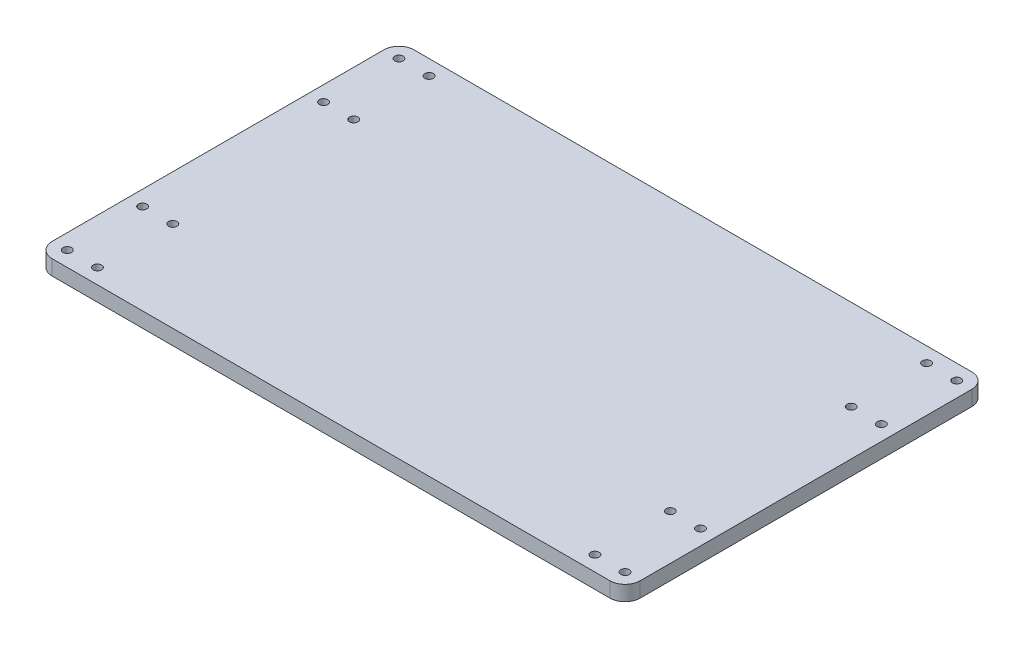
ISO-10303-21;
HEADER;
FILE_DESCRIPTION(('STEP AP214'),'2;1');
FILE_NAME('part.step','',(''),(''),'','','');
FILE_SCHEMA(('AUTOMOTIVE_DESIGN { 1 0 10303 214 1 1 1 1 }'));
ENDSEC;
DATA;
#1=APPLICATION_CONTEXT('core data for automotive mechanical design processes');
#2=APPLICATION_PROTOCOL_DEFINITION('international standard','automotive_design',2000,#1);
#3=PRODUCT_CONTEXT('',#1,'mechanical');
#4=PRODUCT('Part','Part','',(#3));
#5=PRODUCT_RELATED_PRODUCT_CATEGORY('part','',(#4));
#6=PRODUCT_DEFINITION_FORMATION('','',#4);
#7=PRODUCT_DEFINITION_CONTEXT('part definition',#1,'design');
#8=PRODUCT_DEFINITION('design','',#6,#7);
#9=PRODUCT_DEFINITION_SHAPE('','',#8);
#10=(LENGTH_UNIT() NAMED_UNIT(*) SI_UNIT(.MILLI.,.METRE.));
#11=(NAMED_UNIT(*) PLANE_ANGLE_UNIT() SI_UNIT($,.RADIAN.));
#12=(NAMED_UNIT(*) SI_UNIT($,.STERADIAN.) SOLID_ANGLE_UNIT());
#13=UNCERTAINTY_MEASURE_WITH_UNIT(LENGTH_MEASURE(1.E-05),#10,'distance_accuracy_value','');
#14=(GEOMETRIC_REPRESENTATION_CONTEXT(3) GLOBAL_UNCERTAINTY_ASSIGNED_CONTEXT((#13)) GLOBAL_UNIT_ASSIGNED_CONTEXT((#10,
#11,#12)) REPRESENTATION_CONTEXT('',''));
#15=CARTESIAN_POINT('',(0.,0.,0.));
#16=DIRECTION('',(0.,0.,1.));
#17=DIRECTION('',(1.,0.,0.));
#18=AXIS2_PLACEMENT_3D('',#15,#16,#17);
#19=CARTESIAN_POINT('',(123.825,6.35,76.2));
#20=DIRECTION('',(-1.,0.,0.));
#21=DIRECTION('',(0.,0.,1.));
#22=AXIS2_PLACEMENT_3D('',#19,#20,#21);
#23=PLANE('',#22);
#24=DIRECTION('',(0.,0.,-1.));
#25=VECTOR('',#24,1.);
#26=CARTESIAN_POINT('',(123.825,0.,76.2));
#27=LINE('',#26,#25);
#28=CARTESIAN_POINT('',(123.825,0.,69.85));
#29=VERTEX_POINT('',#28);
#30=CARTESIAN_POINT('',(123.825,0.,-69.85));
#31=VERTEX_POINT('',#30);
#32=EDGE_CURVE('E142',#29,#31,#27,.T.);
#33=ORIENTED_EDGE('',*,*,#32,.T.);
#34=DIRECTION('',(0.,-1.,0.));
#35=VECTOR('',#34,1.);
#36=CARTESIAN_POINT('',(123.825,6.35,-69.85));
#37=LINE('',#36,#35);
#38=CARTESIAN_POINT('',(123.825,6.35,-69.85));
#39=VERTEX_POINT('',#38);
#40=EDGE_CURVE('E176',#31,#39,#37,.F.);
#41=ORIENTED_EDGE('',*,*,#40,.T.);
#42=DIRECTION('',(0.,0.,-1.));
#43=VECTOR('',#42,1.);
#44=CARTESIAN_POINT('',(123.825,6.35,76.2));
#45=LINE('',#44,#43);
#46=CARTESIAN_POINT('',(123.825,6.35,69.85));
#47=VERTEX_POINT('',#46);
#48=EDGE_CURVE('E140',#47,#39,#45,.T.);
#49=ORIENTED_EDGE('',*,*,#48,.F.);
#50=DIRECTION('',(0.,-1.,0.));
#51=VECTOR('',#50,1.);
#52=CARTESIAN_POINT('',(123.825,6.35,69.85));
#53=LINE('',#52,#51);
#54=EDGE_CURVE('E172',#47,#29,#53,.T.);
#55=ORIENTED_EDGE('',*,*,#54,.T.);
#56=EDGE_LOOP('',(#33,#41,#49,#55));
#57=FACE_BOUND('',#56,.T.);
#58=ADVANCED_FACE('F41',(#57),#23,.F.);
#59=CARTESIAN_POINT('',(-123.825,6.35,-76.2));
#60=DIRECTION('',(0.,0.,1.));
#61=DIRECTION('',(1.,0.,0.));
#62=AXIS2_PLACEMENT_3D('',#59,#60,#61);
#63=PLANE('',#62);
#64=DIRECTION('',(-1.,0.,0.));
#65=VECTOR('',#64,1.);
#66=CARTESIAN_POINT('',(-123.825,0.,-76.2));
#67=LINE('',#66,#65);
#68=CARTESIAN_POINT('',(117.475,0.,-76.2));
#69=VERTEX_POINT('',#68);
#70=CARTESIAN_POINT('',(-117.475,0.,-76.2));
#71=VERTEX_POINT('',#70);
#72=EDGE_CURVE('E136',#69,#71,#67,.T.);
#73=ORIENTED_EDGE('',*,*,#72,.T.);
#74=DIRECTION('',(0.,-1.,0.));
#75=VECTOR('',#74,1.);
#76=CARTESIAN_POINT('',(-117.475,6.35,-76.2));
#77=LINE('',#76,#75);
#78=CARTESIAN_POINT('',(-117.475,6.35,-76.2));
#79=VERTEX_POINT('',#78);
#80=EDGE_CURVE('E112',#71,#79,#77,.F.);
#81=ORIENTED_EDGE('',*,*,#80,.T.);
#82=DIRECTION('',(-1.,0.,0.));
#83=VECTOR('',#82,1.);
#84=CARTESIAN_POINT('',(-123.825,6.35,-76.2));
#85=LINE('',#84,#83);
#86=CARTESIAN_POINT('',(117.475,6.35,-76.2));
#87=VERTEX_POINT('',#86);
#88=EDGE_CURVE('E195',#87,#79,#85,.T.);
#89=ORIENTED_EDGE('',*,*,#88,.F.);
#90=DIRECTION('',(0.,-1.,0.));
#91=VECTOR('',#90,1.);
#92=CARTESIAN_POINT('',(117.475,6.35,-76.2));
#93=LINE('',#92,#91);
#94=EDGE_CURVE('E118',#87,#69,#93,.T.);
#95=ORIENTED_EDGE('',*,*,#94,.T.);
#96=EDGE_LOOP('',(#73,#81,#89,#95));
#97=FACE_BOUND('',#96,.T.);
#98=ADVANCED_FACE('F368',(#97),#63,.F.);
#99=CARTESIAN_POINT('',(-123.825,6.35,76.2));
#100=DIRECTION('',(1.,0.,0.));
#101=DIRECTION('',(0.,0.,-1.));
#102=AXIS2_PLACEMENT_3D('',#99,#100,#101);
#103=PLANE('',#102);
#104=DIRECTION('',(0.,0.,1.));
#105=VECTOR('',#104,1.);
#106=CARTESIAN_POINT('',(-123.825,6.35,76.2));
#107=LINE('',#106,#105);
#108=CARTESIAN_POINT('',(-123.825,6.35,-69.85));
#109=VERTEX_POINT('',#108);
#110=CARTESIAN_POINT('',(-123.825,6.35,69.85));
#111=VERTEX_POINT('',#110);
#112=EDGE_CURVE('E127',#109,#111,#107,.T.);
#113=ORIENTED_EDGE('',*,*,#112,.F.);
#114=DIRECTION('',(0.,-1.,0.));
#115=VECTOR('',#114,1.);
#116=CARTESIAN_POINT('',(-123.825,6.35,-69.85));
#117=LINE('',#116,#115);
#118=CARTESIAN_POINT('',(-123.825,0.,-69.85));
#119=VERTEX_POINT('',#118);
#120=EDGE_CURVE('E111',#109,#119,#117,.T.);
#121=ORIENTED_EDGE('',*,*,#120,.T.);
#122=DIRECTION('',(0.,0.,1.));
#123=VECTOR('',#122,1.);
#124=CARTESIAN_POINT('',(-123.825,0.,76.2));
#125=LINE('',#124,#123);
#126=CARTESIAN_POINT('',(-123.825,0.,69.85));
#127=VERTEX_POINT('',#126);
#128=EDGE_CURVE('E125',#119,#127,#125,.T.);
#129=ORIENTED_EDGE('',*,*,#128,.T.);
#130=DIRECTION('',(0.,-1.,0.));
#131=VECTOR('',#130,1.);
#132=CARTESIAN_POINT('',(-123.825,6.35,69.85));
#133=LINE('',#132,#131);
#134=EDGE_CURVE('E130',#127,#111,#133,.F.);
#135=ORIENTED_EDGE('',*,*,#134,.T.);
#136=EDGE_LOOP('',(#113,#121,#129,#135));
#137=FACE_BOUND('',#136,.T.);
#138=ADVANCED_FACE('F124',(#137),#103,.F.);
#139=CARTESIAN_POINT('',(-123.825,6.35,76.2));
#140=DIRECTION('',(0.,0.,-1.));
#141=DIRECTION('',(-1.,0.,0.));
#142=AXIS2_PLACEMENT_3D('',#139,#140,#141);
#143=PLANE('',#142);
#144=DIRECTION('',(1.,0.,0.));
#145=VECTOR('',#144,1.);
#146=CARTESIAN_POINT('',(-123.825,0.,76.2));
#147=LINE('',#146,#145);
#148=CARTESIAN_POINT('',(-117.475,0.,76.2));
#149=VERTEX_POINT('',#148);
#150=CARTESIAN_POINT('',(117.475,0.,76.2));
#151=VERTEX_POINT('',#150);
#152=EDGE_CURVE('E135',#149,#151,#147,.T.);
#153=ORIENTED_EDGE('',*,*,#152,.T.);
#154=DIRECTION('',(0.,-1.,0.));
#155=VECTOR('',#154,1.);
#156=CARTESIAN_POINT('',(117.475,6.35,76.2));
#157=LINE('',#156,#155);
#158=CARTESIAN_POINT('',(117.475,6.35,76.2));
#159=VERTEX_POINT('',#158);
#160=EDGE_CURVE('E11',#151,#159,#157,.F.);
#161=ORIENTED_EDGE('',*,*,#160,.T.);
#162=DIRECTION('',(1.,0.,0.));
#163=VECTOR('',#162,1.);
#164=CARTESIAN_POINT('',(-123.825,6.35,76.2));
#165=LINE('',#164,#163);
#166=CARTESIAN_POINT('',(-117.475,6.35,76.2));
#167=VERTEX_POINT('',#166);
#168=EDGE_CURVE('E147',#167,#159,#165,.T.);
#169=ORIENTED_EDGE('',*,*,#168,.F.);
#170=DIRECTION('',(0.,-1.,0.));
#171=VECTOR('',#170,1.);
#172=CARTESIAN_POINT('',(-117.475,6.35,76.2));
#173=LINE('',#172,#171);
#174=EDGE_CURVE('E50',#167,#149,#173,.T.);
#175=ORIENTED_EDGE('',*,*,#174,.T.);
#176=EDGE_LOOP('',(#153,#161,#169,#175));
#177=FACE_BOUND('',#176,.T.);
#178=ADVANCED_FACE('F181',(#177),#143,.F.);
#179=CARTESIAN_POINT('',(0.,6.35,0.));
#180=DIRECTION('',(0.,-1.,0.));
#181=DIRECTION('',(0.,0.,-1.));
#182=AXIS2_PLACEMENT_3D('',#179,#180,#181);
#183=PLANE('',#182);
#184=CARTESIAN_POINT('',(-117.475,6.35,69.85));
#185=DIRECTION('',(0.,1.,0.));
#186=DIRECTION('',(0.,0.,1.));
#187=AXIS2_PLACEMENT_3D('',#184,#185,#186);
#188=CIRCLE('',#187,1.778);
#189=CARTESIAN_POINT('',(-117.475,6.35,71.628));
#190=VERTEX_POINT('',#189);
#191=EDGE_CURVE('E290',#190,#190,#188,.T.);
#192=ORIENTED_EDGE('',*,*,#191,.F.);
#193=EDGE_LOOP('',(#192));
#194=FACE_BOUND('',#193,.T.);
#195=CARTESIAN_POINT('',(-104.775,6.35,38.1));
#196=DIRECTION('',(0.,1.,0.));
#197=DIRECTION('',(0.,0.,1.));
#198=AXIS2_PLACEMENT_3D('',#195,#196,#197);
#199=CIRCLE('',#198,1.77800000000001);
#200=CARTESIAN_POINT('',(-104.775,6.35,39.878));
#201=VERTEX_POINT('',#200);
#202=EDGE_CURVE('E281',#201,#201,#199,.T.);
#203=ORIENTED_EDGE('',*,*,#202,.F.);
#204=EDGE_LOOP('',(#203));
#205=FACE_BOUND('',#204,.T.);
#206=CARTESIAN_POINT('',(-117.475,6.35,38.1));
#207=DIRECTION('',(0.,1.,0.));
#208=DIRECTION('',(0.,0.,1.));
#209=AXIS2_PLACEMENT_3D('',#206,#207,#208);
#210=CIRCLE('',#209,1.77800000000001);
#211=CARTESIAN_POINT('',(-117.475,6.35,39.878));
#212=VERTEX_POINT('',#211);
#213=EDGE_CURVE('E306',#212,#212,#210,.T.);
#214=ORIENTED_EDGE('',*,*,#213,.F.);
#215=EDGE_LOOP('',(#214));
#216=FACE_BOUND('',#215,.T.);
#217=CARTESIAN_POINT('',(-104.775,6.35,-38.1));
#218=DIRECTION('',(0.,1.,0.));
#219=DIRECTION('',(0.,0.,1.));
#220=AXIS2_PLACEMENT_3D('',#217,#218,#219);
#221=CIRCLE('',#220,1.778);
#222=CARTESIAN_POINT('',(-104.775,6.35,-36.322));
#223=VERTEX_POINT('',#222);
#224=EDGE_CURVE('E297',#223,#223,#221,.T.);
#225=ORIENTED_EDGE('',*,*,#224,.F.);
#226=EDGE_LOOP('',(#225));
#227=FACE_BOUND('',#226,.T.);
#228=CARTESIAN_POINT('',(104.775,6.35,-38.1));
#229=DIRECTION('',(0.,1.,0.));
#230=DIRECTION('',(0.,0.,1.));
#231=AXIS2_PLACEMENT_3D('',#228,#229,#230);
#232=CIRCLE('',#231,1.778);
#233=CARTESIAN_POINT('',(104.775,6.35,-36.322));
#234=VERTEX_POINT('',#233);
#235=EDGE_CURVE('E258',#234,#234,#232,.T.);
#236=ORIENTED_EDGE('',*,*,#235,.F.);
#237=EDGE_LOOP('',(#236));
#238=FACE_BOUND('',#237,.T.);
#239=CARTESIAN_POINT('',(117.475,6.35,-69.85));
#240=DIRECTION('',(0.,1.,0.));
#241=DIRECTION('',(0.,0.,1.));
#242=AXIS2_PLACEMENT_3D('',#239,#240,#241);
#243=CIRCLE('',#242,1.77800000000001);
#244=CARTESIAN_POINT('',(117.475,6.35,-68.072));
#245=VERTEX_POINT('',#244);
#246=EDGE_CURVE('E249',#245,#245,#243,.T.);
#247=ORIENTED_EDGE('',*,*,#246,.F.);
#248=EDGE_LOOP('',(#247));
#249=FACE_BOUND('',#248,.T.);
#250=CARTESIAN_POINT('',(104.775,6.35,-69.85));
#251=DIRECTION('',(0.,1.,0.));
#252=DIRECTION('',(0.,0.,1.));
#253=AXIS2_PLACEMENT_3D('',#250,#251,#252);
#254=CIRCLE('',#253,1.77800000000001);
#255=CARTESIAN_POINT('',(104.775,6.35,-68.072));
#256=VERTEX_POINT('',#255);
#257=EDGE_CURVE('E274',#256,#256,#254,.T.);
#258=ORIENTED_EDGE('',*,*,#257,.F.);
#259=EDGE_LOOP('',(#258));
#260=FACE_BOUND('',#259,.T.);
#261=CARTESIAN_POINT('',(-104.775,6.35,69.85));
#262=DIRECTION('',(0.,1.,0.));
#263=DIRECTION('',(0.,0.,1.));
#264=AXIS2_PLACEMENT_3D('',#261,#262,#263);
#265=CIRCLE('',#264,1.778);
#266=CARTESIAN_POINT('',(-104.775,6.35,71.628));
#267=VERTEX_POINT('',#266);
#268=EDGE_CURVE('E265',#267,#267,#265,.T.);
#269=ORIENTED_EDGE('',*,*,#268,.F.);
#270=EDGE_LOOP('',(#269));
#271=FACE_BOUND('',#270,.T.);
#272=CARTESIAN_POINT('',(-117.475,6.35,-69.85));
#273=DIRECTION('',(0.,1.,0.));
#274=DIRECTION('',(0.,0.,1.));
#275=AXIS2_PLACEMENT_3D('',#272,#273,#274);
#276=CIRCLE('',#275,1.77800000000001);
#277=CARTESIAN_POINT('',(-117.475,6.35,-68.072));
#278=VERTEX_POINT('',#277);
#279=EDGE_CURVE('E329',#278,#278,#276,.T.);
#280=ORIENTED_EDGE('',*,*,#279,.F.);
#281=EDGE_LOOP('',(#280));
#282=FACE_BOUND('',#281,.T.);
#283=CARTESIAN_POINT('',(-104.775,6.35,-69.85));
#284=DIRECTION('',(0.,1.,0.));
#285=DIRECTION('',(0.,0.,1.));
#286=AXIS2_PLACEMENT_3D('',#283,#284,#285);
#287=CIRCLE('',#286,1.77800000000001);
#288=CARTESIAN_POINT('',(-104.775,6.35,-68.072));
#289=VERTEX_POINT('',#288);
#290=EDGE_CURVE('E313',#289,#289,#287,.T.);
#291=ORIENTED_EDGE('',*,*,#290,.F.);
#292=EDGE_LOOP('',(#291));
#293=FACE_BOUND('',#292,.T.);
#294=CARTESIAN_POINT('',(-117.475,6.35,-38.1));
#295=DIRECTION('',(0.,1.,0.));
#296=DIRECTION('',(0.,0.,1.));
#297=AXIS2_PLACEMENT_3D('',#294,#295,#296);
#298=CIRCLE('',#297,1.778);
#299=CARTESIAN_POINT('',(-117.475,6.35,-36.322));
#300=VERTEX_POINT('',#299);
#301=EDGE_CURVE('E322',#300,#300,#298,.T.);
#302=ORIENTED_EDGE('',*,*,#301,.F.);
#303=EDGE_LOOP('',(#302));
#304=FACE_BOUND('',#303,.T.);
#305=CARTESIAN_POINT('',(117.475,6.35,-38.1));
#306=DIRECTION('',(0.,1.,0.));
#307=DIRECTION('',(0.,0.,1.));
#308=AXIS2_PLACEMENT_3D('',#305,#306,#307);
#309=CIRCLE('',#308,1.778);
#310=CARTESIAN_POINT('',(117.475,6.35,-36.322));
#311=VERTEX_POINT('',#310);
#312=EDGE_CURVE('E241',#311,#311,#309,.T.);
#313=ORIENTED_EDGE('',*,*,#312,.F.);
#314=EDGE_LOOP('',(#313));
#315=FACE_BOUND('',#314,.T.);
#316=CARTESIAN_POINT('',(104.775,6.35,69.85));
#317=DIRECTION('',(0.,1.,0.));
#318=DIRECTION('',(0.,0.,1.));
#319=AXIS2_PLACEMENT_3D('',#316,#317,#318);
#320=CIRCLE('',#319,1.778);
#321=CARTESIAN_POINT('',(104.775,6.35,71.628));
#322=VERTEX_POINT('',#321);
#323=EDGE_CURVE('E226',#322,#322,#320,.T.);
#324=ORIENTED_EDGE('',*,*,#323,.F.);
#325=EDGE_LOOP('',(#324));
#326=FACE_BOUND('',#325,.T.);
#327=CARTESIAN_POINT('',(117.475,6.35,38.1));
#328=DIRECTION('',(0.,1.,0.));
#329=DIRECTION('',(0.,0.,1.));
#330=AXIS2_PLACEMENT_3D('',#327,#328,#329);
#331=CIRCLE('',#330,1.77800000000001);
#332=CARTESIAN_POINT('',(117.475,6.35,39.878));
#333=VERTEX_POINT('',#332);
#334=EDGE_CURVE('E217',#333,#333,#331,.T.);
#335=ORIENTED_EDGE('',*,*,#334,.F.);
#336=EDGE_LOOP('',(#335));
#337=FACE_BOUND('',#336,.T.);
#338=CARTESIAN_POINT('',(104.775,6.35,38.1));
#339=DIRECTION('',(0.,1.,0.));
#340=DIRECTION('',(0.,0.,1.));
#341=AXIS2_PLACEMENT_3D('',#338,#339,#340);
#342=CIRCLE('',#341,1.77800000000001);
#343=CARTESIAN_POINT('',(104.775,6.35,39.878));
#344=VERTEX_POINT('',#343);
#345=EDGE_CURVE('E233',#344,#344,#342,.T.);
#346=ORIENTED_EDGE('',*,*,#345,.F.);
#347=EDGE_LOOP('',(#346));
#348=FACE_BOUND('',#347,.T.);
#349=CARTESIAN_POINT('',(117.475,6.35,69.85));
#350=DIRECTION('',(0.,1.,0.));
#351=DIRECTION('',(0.,0.,1.));
#352=AXIS2_PLACEMENT_3D('',#349,#350,#351);
#353=CIRCLE('',#352,1.778);
#354=CARTESIAN_POINT('',(117.475,6.35,71.628));
#355=VERTEX_POINT('',#354);
#356=EDGE_CURVE('E201',#355,#355,#353,.T.);
#357=ORIENTED_EDGE('',*,*,#356,.F.);
#358=EDGE_LOOP('',(#357));
#359=FACE_BOUND('',#358,.T.);
#360=ORIENTED_EDGE('',*,*,#88,.T.);
#361=CARTESIAN_POINT('',(-117.475,6.35,-69.85));
#362=DIRECTION('',(0.,-1.,0.));
#363=DIRECTION('',(0.,0.,-1.));
#364=AXIS2_PLACEMENT_3D('',#361,#362,#363);
#365=CIRCLE('',#364,6.35);
#366=EDGE_CURVE('E169',#79,#109,#365,.F.);
#367=ORIENTED_EDGE('',*,*,#366,.T.);
#368=ORIENTED_EDGE('',*,*,#112,.T.);
#369=CARTESIAN_POINT('',(-117.475,6.35,69.85));
#370=DIRECTION('',(0.,-1.,0.));
#371=DIRECTION('',(0.,0.,-1.));
#372=AXIS2_PLACEMENT_3D('',#369,#370,#371);
#373=CIRCLE('',#372,6.35);
#374=EDGE_CURVE('E62',#111,#167,#373,.F.);
#375=ORIENTED_EDGE('',*,*,#374,.T.);
#376=ORIENTED_EDGE('',*,*,#168,.T.);
#377=CARTESIAN_POINT('',(117.475,6.35,69.85));
#378=DIRECTION('',(0.,-1.,0.));
#379=DIRECTION('',(0.,0.,-1.));
#380=AXIS2_PLACEMENT_3D('',#377,#378,#379);
#381=CIRCLE('',#380,6.35);
#382=EDGE_CURVE('E163',#159,#47,#381,.F.);
#383=ORIENTED_EDGE('',*,*,#382,.T.);
#384=ORIENTED_EDGE('',*,*,#48,.T.);
#385=CARTESIAN_POINT('',(117.475,6.35,-69.85));
#386=DIRECTION('',(0.,-1.,0.));
#387=DIRECTION('',(0.,0.,-1.));
#388=AXIS2_PLACEMENT_3D('',#385,#386,#387);
#389=CIRCLE('',#388,6.35);
#390=EDGE_CURVE('E166',#39,#87,#389,.F.);
#391=ORIENTED_EDGE('',*,*,#390,.T.);
#392=EDGE_LOOP('',(#360,#367,#368,#375,#376,#383,#384,#391));
#393=FACE_BOUND('',#392,.T.);
#394=ADVANCED_FACE('F347',(#194,#205,#216,#227,#238,#249,#260,#271,#282,#293,#304,#315,#326,
#337,#348,#359,#393),#183,.F.);
#395=CARTESIAN_POINT('',(0.,0.,0.));
#396=DIRECTION('',(0.,-1.,0.));
#397=DIRECTION('',(0.,0.,-1.));
#398=AXIS2_PLACEMENT_3D('',#395,#396,#397);
#399=PLANE('',#398);
#400=CARTESIAN_POINT('',(-117.475,0.,69.85));
#401=DIRECTION('',(0.,1.,0.));
#402=DIRECTION('',(0.,0.,1.));
#403=AXIS2_PLACEMENT_3D('',#400,#401,#402);
#404=CIRCLE('',#403,1.778);
#405=CARTESIAN_POINT('',(-117.475,0.,71.628));
#406=VERTEX_POINT('',#405);
#407=EDGE_CURVE('E270',#406,#406,#404,.T.);
#408=ORIENTED_EDGE('',*,*,#407,.T.);
#409=EDGE_LOOP('',(#408));
#410=FACE_BOUND('',#409,.T.);
#411=CARTESIAN_POINT('',(-104.775,0.,38.1));
#412=DIRECTION('',(0.,1.,0.));
#413=DIRECTION('',(0.,0.,1.));
#414=AXIS2_PLACEMENT_3D('',#411,#412,#413);
#415=CIRCLE('',#414,1.77800000000001);
#416=CARTESIAN_POINT('',(-104.775,0.,39.878));
#417=VERTEX_POINT('',#416);
#418=EDGE_CURVE('E285',#417,#417,#415,.T.);
#419=ORIENTED_EDGE('',*,*,#418,.T.);
#420=EDGE_LOOP('',(#419));
#421=FACE_BOUND('',#420,.T.);
#422=CARTESIAN_POINT('',(-117.475,0.,38.1));
#423=DIRECTION('',(0.,1.,0.));
#424=DIRECTION('',(0.,0.,1.));
#425=AXIS2_PLACEMENT_3D('',#422,#423,#424);
#426=CIRCLE('',#425,1.77800000000001);
#427=CARTESIAN_POINT('',(-117.475,0.,39.878));
#428=VERTEX_POINT('',#427);
#429=EDGE_CURVE('E286',#428,#428,#426,.T.);
#430=ORIENTED_EDGE('',*,*,#429,.T.);
#431=EDGE_LOOP('',(#430));
#432=FACE_BOUND('',#431,.T.);
#433=CARTESIAN_POINT('',(-104.775,0.,-38.1));
#434=DIRECTION('',(0.,1.,0.));
#435=DIRECTION('',(0.,0.,1.));
#436=AXIS2_PLACEMENT_3D('',#433,#434,#435);
#437=CIRCLE('',#436,1.778);
#438=CARTESIAN_POINT('',(-104.775,0.,-36.322));
#439=VERTEX_POINT('',#438);
#440=EDGE_CURVE('E301',#439,#439,#437,.T.);
#441=ORIENTED_EDGE('',*,*,#440,.T.);
#442=EDGE_LOOP('',(#441));
#443=FACE_BOUND('',#442,.T.);
#444=CARTESIAN_POINT('',(104.775,0.,-38.1));
#445=DIRECTION('',(0.,1.,0.));
#446=DIRECTION('',(0.,0.,1.));
#447=AXIS2_PLACEMENT_3D('',#444,#445,#446);
#448=CIRCLE('',#447,1.778);
#449=CARTESIAN_POINT('',(104.775,0.,-36.322));
#450=VERTEX_POINT('',#449);
#451=EDGE_CURVE('E245',#450,#450,#448,.T.);
#452=ORIENTED_EDGE('',*,*,#451,.T.);
#453=EDGE_LOOP('',(#452));
#454=FACE_BOUND('',#453,.T.);
#455=CARTESIAN_POINT('',(117.475,0.,-69.85));
#456=DIRECTION('',(0.,1.,0.));
#457=DIRECTION('',(0.,0.,1.));
#458=AXIS2_PLACEMENT_3D('',#455,#456,#457);
#459=CIRCLE('',#458,1.77800000000001);
#460=CARTESIAN_POINT('',(117.475,0.,-68.072));
#461=VERTEX_POINT('',#460);
#462=EDGE_CURVE('E253',#461,#461,#459,.T.);
#463=ORIENTED_EDGE('',*,*,#462,.T.);
#464=EDGE_LOOP('',(#463));
#465=FACE_BOUND('',#464,.T.);
#466=CARTESIAN_POINT('',(104.775,0.,-69.85));
#467=DIRECTION('',(0.,1.,0.));
#468=DIRECTION('',(0.,0.,1.));
#469=AXIS2_PLACEMENT_3D('',#466,#467,#468);
#470=CIRCLE('',#469,1.77800000000001);
#471=CARTESIAN_POINT('',(104.775,0.,-68.072));
#472=VERTEX_POINT('',#471);
#473=EDGE_CURVE('E254',#472,#472,#470,.T.);
#474=ORIENTED_EDGE('',*,*,#473,.T.);
#475=EDGE_LOOP('',(#474));
#476=FACE_BOUND('',#475,.T.);
#477=CARTESIAN_POINT('',(-104.775,0.,69.85));
#478=DIRECTION('',(0.,1.,0.));
#479=DIRECTION('',(0.,0.,1.));
#480=AXIS2_PLACEMENT_3D('',#477,#478,#479);
#481=CIRCLE('',#480,1.778);
#482=CARTESIAN_POINT('',(-104.775,0.,71.628));
#483=VERTEX_POINT('',#482);
#484=EDGE_CURVE('E269',#483,#483,#481,.T.);
#485=ORIENTED_EDGE('',*,*,#484,.T.);
#486=EDGE_LOOP('',(#485));
#487=FACE_BOUND('',#486,.T.);
#488=CARTESIAN_POINT('',(-117.475,0.,-69.85));
#489=DIRECTION('',(0.,1.,0.));
#490=DIRECTION('',(0.,0.,1.));
#491=AXIS2_PLACEMENT_3D('',#488,#489,#490);
#492=CIRCLE('',#491,1.77800000000001);
#493=CARTESIAN_POINT('',(-117.475,0.,-68.072));
#494=VERTEX_POINT('',#493);
#495=EDGE_CURVE('E318',#494,#494,#492,.T.);
#496=ORIENTED_EDGE('',*,*,#495,.T.);
#497=EDGE_LOOP('',(#496));
#498=FACE_BOUND('',#497,.T.);
#499=CARTESIAN_POINT('',(-104.775,0.,-69.85));
#500=DIRECTION('',(0.,1.,0.));
#501=DIRECTION('',(0.,0.,1.));
#502=AXIS2_PLACEMENT_3D('',#499,#500,#501);
#503=CIRCLE('',#502,1.77800000000001);
#504=CARTESIAN_POINT('',(-104.775,0.,-68.072));
#505=VERTEX_POINT('',#504);
#506=EDGE_CURVE('E317',#505,#505,#503,.T.);
#507=ORIENTED_EDGE('',*,*,#506,.T.);
#508=EDGE_LOOP('',(#507));
#509=FACE_BOUND('',#508,.T.);
#510=CARTESIAN_POINT('',(-117.475,0.,-38.1));
#511=DIRECTION('',(0.,1.,0.));
#512=DIRECTION('',(0.,0.,1.));
#513=AXIS2_PLACEMENT_3D('',#510,#511,#512);
#514=CIRCLE('',#513,1.778);
#515=CARTESIAN_POINT('',(-117.475,0.,-36.322));
#516=VERTEX_POINT('',#515);
#517=EDGE_CURVE('E302',#516,#516,#514,.T.);
#518=ORIENTED_EDGE('',*,*,#517,.T.);
#519=EDGE_LOOP('',(#518));
#520=FACE_BOUND('',#519,.T.);
#521=CARTESIAN_POINT('',(117.475,0.,-38.1));
#522=DIRECTION('',(0.,1.,0.));
#523=DIRECTION('',(0.,0.,1.));
#524=AXIS2_PLACEMENT_3D('',#521,#522,#523);
#525=CIRCLE('',#524,1.778);
#526=CARTESIAN_POINT('',(117.475,0.,-36.322));
#527=VERTEX_POINT('',#526);
#528=EDGE_CURVE('E237',#527,#527,#525,.T.);
#529=ORIENTED_EDGE('',*,*,#528,.T.);
#530=EDGE_LOOP('',(#529));
#531=FACE_BOUND('',#530,.T.);
#532=CARTESIAN_POINT('',(104.775,0.,69.85));
#533=DIRECTION('',(0.,1.,0.));
#534=DIRECTION('',(0.,0.,1.));
#535=AXIS2_PLACEMENT_3D('',#532,#533,#534);
#536=CIRCLE('',#535,1.778);
#537=CARTESIAN_POINT('',(104.775,0.,71.628));
#538=VERTEX_POINT('',#537);
#539=EDGE_CURVE('E215',#538,#538,#536,.T.);
#540=ORIENTED_EDGE('',*,*,#539,.T.);
#541=EDGE_LOOP('',(#540));
#542=FACE_BOUND('',#541,.T.);
#543=CARTESIAN_POINT('',(117.475,0.,38.1));
#544=DIRECTION('',(0.,1.,0.));
#545=DIRECTION('',(0.,0.,1.));
#546=AXIS2_PLACEMENT_3D('',#543,#544,#545);
#547=CIRCLE('',#546,1.77800000000001);
#548=CARTESIAN_POINT('',(117.475,0.,39.878));
#549=VERTEX_POINT('',#548);
#550=EDGE_CURVE('E221',#549,#549,#547,.T.);
#551=ORIENTED_EDGE('',*,*,#550,.T.);
#552=EDGE_LOOP('',(#551));
#553=FACE_BOUND('',#552,.T.);
#554=CARTESIAN_POINT('',(104.775,0.,38.1));
#555=DIRECTION('',(0.,1.,0.));
#556=DIRECTION('',(0.,0.,1.));
#557=AXIS2_PLACEMENT_3D('',#554,#555,#556);
#558=CIRCLE('',#557,1.77800000000001);
#559=CARTESIAN_POINT('',(104.775,0.,39.878));
#560=VERTEX_POINT('',#559);
#561=EDGE_CURVE('E222',#560,#560,#558,.T.);
#562=ORIENTED_EDGE('',*,*,#561,.T.);
#563=EDGE_LOOP('',(#562));
#564=FACE_BOUND('',#563,.T.);
#565=CARTESIAN_POINT('',(117.475,0.,69.85));
#566=DIRECTION('',(0.,1.,0.));
#567=DIRECTION('',(0.,0.,1.));
#568=AXIS2_PLACEMENT_3D('',#565,#566,#567);
#569=CIRCLE('',#568,1.778);
#570=CARTESIAN_POINT('',(117.475,0.,71.628));
#571=VERTEX_POINT('',#570);
#572=EDGE_CURVE('E208',#571,#571,#569,.T.);
#573=ORIENTED_EDGE('',*,*,#572,.T.);
#574=EDGE_LOOP('',(#573));
#575=FACE_BOUND('',#574,.T.);
#576=ORIENTED_EDGE('',*,*,#128,.F.);
#577=CARTESIAN_POINT('',(-117.475,0.,-69.85));
#578=DIRECTION('',(0.,-1.,0.));
#579=DIRECTION('',(0.,0.,-1.));
#580=AXIS2_PLACEMENT_3D('',#577,#578,#579);
#581=CIRCLE('',#580,6.35);
#582=EDGE_CURVE('E107',#119,#71,#581,.T.);
#583=ORIENTED_EDGE('',*,*,#582,.T.);
#584=ORIENTED_EDGE('',*,*,#72,.F.);
#585=CARTESIAN_POINT('',(117.475,0.,-69.85));
#586=DIRECTION('',(0.,-1.,0.));
#587=DIRECTION('',(0.,0.,-1.));
#588=AXIS2_PLACEMENT_3D('',#585,#586,#587);
#589=CIRCLE('',#588,6.35);
#590=EDGE_CURVE('E119',#69,#31,#589,.T.);
#591=ORIENTED_EDGE('',*,*,#590,.T.);
#592=ORIENTED_EDGE('',*,*,#32,.F.);
#593=CARTESIAN_POINT('',(117.475,0.,69.85));
#594=DIRECTION('',(0.,-1.,0.));
#595=DIRECTION('',(0.,0.,-1.));
#596=AXIS2_PLACEMENT_3D('',#593,#594,#595);
#597=CIRCLE('',#596,6.35);
#598=EDGE_CURVE('E151',#29,#151,#597,.T.);
#599=ORIENTED_EDGE('',*,*,#598,.T.);
#600=ORIENTED_EDGE('',*,*,#152,.F.);
#601=CARTESIAN_POINT('',(-117.475,0.,69.85));
#602=DIRECTION('',(0.,-1.,0.));
#603=DIRECTION('',(0.,0.,-1.));
#604=AXIS2_PLACEMENT_3D('',#601,#602,#603);
#605=CIRCLE('',#604,6.35);
#606=EDGE_CURVE('E129',#149,#127,#605,.T.);
#607=ORIENTED_EDGE('',*,*,#606,.T.);
#608=EDGE_LOOP('',(#576,#583,#584,#591,#592,#599,#600,#607));
#609=FACE_BOUND('',#608,.T.);
#610=ADVANCED_FACE('F132',(#410,#421,#432,#443,#454,#465,#476,#487,#498,#509,#520,#531,#542,
#553,#564,#575,#609),#399,.T.);
#611=CARTESIAN_POINT('',(-117.475,6.35,-69.85));
#612=DIRECTION('',(0.,-1.,0.));
#613=DIRECTION('',(0.,0.,-1.));
#614=AXIS2_PLACEMENT_3D('',#611,#612,#613);
#615=CYLINDRICAL_SURFACE('',#614,6.35);
#616=ORIENTED_EDGE('',*,*,#366,.F.);
#617=ORIENTED_EDGE('',*,*,#80,.F.);
#618=ORIENTED_EDGE('',*,*,#582,.F.);
#619=ORIENTED_EDGE('',*,*,#120,.F.);
#620=EDGE_LOOP('',(#616,#617,#618,#619));
#621=FACE_BOUND('',#620,.T.);
#622=ADVANCED_FACE('F110',(#621),#615,.T.);
#623=CARTESIAN_POINT('',(117.475,6.35,-69.85));
#624=DIRECTION('',(0.,-1.,0.));
#625=DIRECTION('',(0.,0.,-1.));
#626=AXIS2_PLACEMENT_3D('',#623,#624,#625);
#627=CYLINDRICAL_SURFACE('',#626,6.35);
#628=ORIENTED_EDGE('',*,*,#390,.F.);
#629=ORIENTED_EDGE('',*,*,#40,.F.);
#630=ORIENTED_EDGE('',*,*,#590,.F.);
#631=ORIENTED_EDGE('',*,*,#94,.F.);
#632=EDGE_LOOP('',(#628,#629,#630,#631));
#633=FACE_BOUND('',#632,.T.);
#634=ADVANCED_FACE('F370',(#633),#627,.T.);
#635=CARTESIAN_POINT('',(117.475,6.35,69.85));
#636=DIRECTION('',(0.,-1.,0.));
#637=DIRECTION('',(0.,0.,-1.));
#638=AXIS2_PLACEMENT_3D('',#635,#636,#637);
#639=CYLINDRICAL_SURFACE('',#638,6.35);
#640=ORIENTED_EDGE('',*,*,#382,.F.);
#641=ORIENTED_EDGE('',*,*,#160,.F.);
#642=ORIENTED_EDGE('',*,*,#598,.F.);
#643=ORIENTED_EDGE('',*,*,#54,.F.);
#644=EDGE_LOOP('',(#640,#641,#642,#643));
#645=FACE_BOUND('',#644,.T.);
#646=ADVANCED_FACE('F188',(#645),#639,.T.);
#647=CARTESIAN_POINT('',(-117.475,6.35,69.85));
#648=DIRECTION('',(0.,-1.,0.));
#649=DIRECTION('',(0.,0.,-1.));
#650=AXIS2_PLACEMENT_3D('',#647,#648,#649);
#651=CYLINDRICAL_SURFACE('',#650,6.35);
#652=ORIENTED_EDGE('',*,*,#374,.F.);
#653=ORIENTED_EDGE('',*,*,#134,.F.);
#654=ORIENTED_EDGE('',*,*,#606,.F.);
#655=ORIENTED_EDGE('',*,*,#174,.F.);
#656=EDGE_LOOP('',(#652,#653,#654,#655));
#657=FACE_BOUND('',#656,.T.);
#658=ADVANCED_FACE('F43',(#657),#651,.T.);
#659=CARTESIAN_POINT('',(117.475,0.,69.85));
#660=DIRECTION('',(0.,1.,0.));
#661=DIRECTION('',(0.,0.,1.));
#662=AXIS2_PLACEMENT_3D('',#659,#660,#661);
#663=CYLINDRICAL_SURFACE('',#662,1.778);
#664=ORIENTED_EDGE('',*,*,#572,.F.);
#665=EDGE_LOOP('',(#664));
#666=FACE_BOUND('',#665,.T.);
#667=ORIENTED_EDGE('',*,*,#356,.T.);
#668=EDGE_LOOP('',(#667));
#669=FACE_BOUND('',#668,.T.);
#670=ADVANCED_FACE('F392',(#666,#669),#663,.F.);
#671=CARTESIAN_POINT('',(104.775,0.,38.1));
#672=DIRECTION('',(0.,1.,0.));
#673=DIRECTION('',(0.,0.,1.));
#674=AXIS2_PLACEMENT_3D('',#671,#672,#673);
#675=CYLINDRICAL_SURFACE('',#674,1.77800000000001);
#676=ORIENTED_EDGE('',*,*,#561,.F.);
#677=EDGE_LOOP('',(#676));
#678=FACE_BOUND('',#677,.T.);
#679=ORIENTED_EDGE('',*,*,#345,.T.);
#680=EDGE_LOOP('',(#679));
#681=FACE_BOUND('',#680,.T.);
#682=ADVANCED_FACE('F395',(#678,#681),#675,.F.);
#683=CARTESIAN_POINT('',(117.475,0.,38.1));
#684=DIRECTION('',(0.,1.,0.));
#685=DIRECTION('',(0.,0.,1.));
#686=AXIS2_PLACEMENT_3D('',#683,#684,#685);
#687=CYLINDRICAL_SURFACE('',#686,1.77800000000001);
#688=ORIENTED_EDGE('',*,*,#550,.F.);
#689=EDGE_LOOP('',(#688));
#690=FACE_BOUND('',#689,.T.);
#691=ORIENTED_EDGE('',*,*,#334,.T.);
#692=EDGE_LOOP('',(#691));
#693=FACE_BOUND('',#692,.T.);
#694=ADVANCED_FACE('F397',(#690,#693),#687,.F.);
#695=CARTESIAN_POINT('',(104.775,0.,69.85));
#696=DIRECTION('',(0.,1.,0.));
#697=DIRECTION('',(0.,0.,1.));
#698=AXIS2_PLACEMENT_3D('',#695,#696,#697);
#699=CYLINDRICAL_SURFACE('',#698,1.778);
#700=ORIENTED_EDGE('',*,*,#539,.F.);
#701=EDGE_LOOP('',(#700));
#702=FACE_BOUND('',#701,.T.);
#703=ORIENTED_EDGE('',*,*,#323,.T.);
#704=EDGE_LOOP('',(#703));
#705=FACE_BOUND('',#704,.T.);
#706=ADVANCED_FACE('F400',(#702,#705),#699,.F.);
#707=CARTESIAN_POINT('',(117.475,0.,-38.1));
#708=DIRECTION('',(0.,1.,0.));
#709=DIRECTION('',(0.,0.,1.));
#710=AXIS2_PLACEMENT_3D('',#707,#708,#709);
#711=CYLINDRICAL_SURFACE('',#710,1.778);
#712=ORIENTED_EDGE('',*,*,#528,.F.);
#713=EDGE_LOOP('',(#712));
#714=FACE_BOUND('',#713,.T.);
#715=ORIENTED_EDGE('',*,*,#312,.T.);
#716=EDGE_LOOP('',(#715));
#717=FACE_BOUND('',#716,.T.);
#718=ADVANCED_FACE('F404',(#714,#717),#711,.F.);
#719=CARTESIAN_POINT('',(-117.475,0.,-38.1));
#720=DIRECTION('',(0.,1.,0.));
#721=DIRECTION('',(0.,0.,1.));
#722=AXIS2_PLACEMENT_3D('',#719,#720,#721);
#723=CYLINDRICAL_SURFACE('',#722,1.778);
#724=ORIENTED_EDGE('',*,*,#517,.F.);
#725=EDGE_LOOP('',(#724));
#726=FACE_BOUND('',#725,.T.);
#727=ORIENTED_EDGE('',*,*,#301,.T.);
#728=EDGE_LOOP('',(#727));
#729=FACE_BOUND('',#728,.T.);
#730=ADVANCED_FACE('F411',(#726,#729),#723,.F.);
#731=CARTESIAN_POINT('',(-104.775,0.,-69.85));
#732=DIRECTION('',(0.,1.,0.));
#733=DIRECTION('',(0.,0.,1.));
#734=AXIS2_PLACEMENT_3D('',#731,#732,#733);
#735=CYLINDRICAL_SURFACE('',#734,1.77800000000001);
#736=ORIENTED_EDGE('',*,*,#506,.F.);
#737=EDGE_LOOP('',(#736));
#738=FACE_BOUND('',#737,.T.);
#739=ORIENTED_EDGE('',*,*,#290,.T.);
#740=EDGE_LOOP('',(#739));
#741=FACE_BOUND('',#740,.T.);
#742=ADVANCED_FACE('F343',(#738,#741),#735,.F.);
#743=CARTESIAN_POINT('',(-117.475,0.,-69.85));
#744=DIRECTION('',(0.,1.,0.));
#745=DIRECTION('',(0.,0.,1.));
#746=AXIS2_PLACEMENT_3D('',#743,#744,#745);
#747=CYLINDRICAL_SURFACE('',#746,1.77800000000001);
#748=ORIENTED_EDGE('',*,*,#495,.F.);
#749=EDGE_LOOP('',(#748));
#750=FACE_BOUND('',#749,.T.);
#751=ORIENTED_EDGE('',*,*,#279,.T.);
#752=EDGE_LOOP('',(#751));
#753=FACE_BOUND('',#752,.T.);
#754=ADVANCED_FACE('F339',(#750,#753),#747,.F.);
#755=CARTESIAN_POINT('',(-104.775,0.,69.85));
#756=DIRECTION('',(0.,1.,0.));
#757=DIRECTION('',(0.,0.,1.));
#758=AXIS2_PLACEMENT_3D('',#755,#756,#757);
#759=CYLINDRICAL_SURFACE('',#758,1.778);
#760=ORIENTED_EDGE('',*,*,#484,.F.);
#761=EDGE_LOOP('',(#760));
#762=FACE_BOUND('',#761,.T.);
#763=ORIENTED_EDGE('',*,*,#268,.T.);
#764=EDGE_LOOP('',(#763));
#765=FACE_BOUND('',#764,.T.);
#766=ADVANCED_FACE('F342',(#762,#765),#759,.F.);
#767=CARTESIAN_POINT('',(104.775,0.,-69.85));
#768=DIRECTION('',(0.,1.,0.));
#769=DIRECTION('',(0.,0.,1.));
#770=AXIS2_PLACEMENT_3D('',#767,#768,#769);
#771=CYLINDRICAL_SURFACE('',#770,1.77800000000001);
#772=ORIENTED_EDGE('',*,*,#473,.F.);
#773=EDGE_LOOP('',(#772));
#774=FACE_BOUND('',#773,.T.);
#775=ORIENTED_EDGE('',*,*,#257,.T.);
#776=EDGE_LOOP('',(#775));
#777=FACE_BOUND('',#776,.T.);
#778=ADVANCED_FACE('F417',(#774,#777),#771,.F.);
#779=CARTESIAN_POINT('',(117.475,0.,-69.85));
#780=DIRECTION('',(0.,1.,0.));
#781=DIRECTION('',(0.,0.,1.));
#782=AXIS2_PLACEMENT_3D('',#779,#780,#781);
#783=CYLINDRICAL_SURFACE('',#782,1.77800000000001);
#784=ORIENTED_EDGE('',*,*,#462,.F.);
#785=EDGE_LOOP('',(#784));
#786=FACE_BOUND('',#785,.T.);
#787=ORIENTED_EDGE('',*,*,#246,.T.);
#788=EDGE_LOOP('',(#787));
#789=FACE_BOUND('',#788,.T.);
#790=ADVANCED_FACE('F413',(#786,#789),#783,.F.);
#791=CARTESIAN_POINT('',(104.775,0.,-38.1));
#792=DIRECTION('',(0.,1.,0.));
#793=DIRECTION('',(0.,0.,1.));
#794=AXIS2_PLACEMENT_3D('',#791,#792,#793);
#795=CYLINDRICAL_SURFACE('',#794,1.778);
#796=ORIENTED_EDGE('',*,*,#451,.F.);
#797=EDGE_LOOP('',(#796));
#798=FACE_BOUND('',#797,.T.);
#799=ORIENTED_EDGE('',*,*,#235,.T.);
#800=EDGE_LOOP('',(#799));
#801=FACE_BOUND('',#800,.T.);
#802=ADVANCED_FACE('F416',(#798,#801),#795,.F.);
#803=CARTESIAN_POINT('',(-104.775,0.,-38.1));
#804=DIRECTION('',(0.,1.,0.));
#805=DIRECTION('',(0.,0.,1.));
#806=AXIS2_PLACEMENT_3D('',#803,#804,#805);
#807=CYLINDRICAL_SURFACE('',#806,1.778);
#808=ORIENTED_EDGE('',*,*,#440,.F.);
#809=EDGE_LOOP('',(#808));
#810=FACE_BOUND('',#809,.T.);
#811=ORIENTED_EDGE('',*,*,#224,.T.);
#812=EDGE_LOOP('',(#811));
#813=FACE_BOUND('',#812,.T.);
#814=ADVANCED_FACE('F421',(#810,#813),#807,.F.);
#815=CARTESIAN_POINT('',(-117.475,0.,38.1));
#816=DIRECTION('',(0.,1.,0.));
#817=DIRECTION('',(0.,0.,1.));
#818=AXIS2_PLACEMENT_3D('',#815,#816,#817);
#819=CYLINDRICAL_SURFACE('',#818,1.77800000000001);
#820=ORIENTED_EDGE('',*,*,#429,.F.);
#821=EDGE_LOOP('',(#820));
#822=FACE_BOUND('',#821,.T.);
#823=ORIENTED_EDGE('',*,*,#213,.T.);
#824=EDGE_LOOP('',(#823));
#825=FACE_BOUND('',#824,.T.);
#826=ADVANCED_FACE('F433',(#822,#825),#819,.F.);
#827=CARTESIAN_POINT('',(-104.775,0.,38.1));
#828=DIRECTION('',(0.,1.,0.));
#829=DIRECTION('',(0.,0.,1.));
#830=AXIS2_PLACEMENT_3D('',#827,#828,#829);
#831=CYLINDRICAL_SURFACE('',#830,1.77800000000001);
#832=ORIENTED_EDGE('',*,*,#418,.F.);
#833=EDGE_LOOP('',(#832));
#834=FACE_BOUND('',#833,.T.);
#835=ORIENTED_EDGE('',*,*,#202,.T.);
#836=EDGE_LOOP('',(#835));
#837=FACE_BOUND('',#836,.T.);
#838=ADVANCED_FACE('F429',(#834,#837),#831,.F.);
#839=CARTESIAN_POINT('',(-117.475,0.,69.85));
#840=DIRECTION('',(0.,1.,0.));
#841=DIRECTION('',(0.,0.,1.));
#842=AXIS2_PLACEMENT_3D('',#839,#840,#841);
#843=CYLINDRICAL_SURFACE('',#842,1.778);
#844=ORIENTED_EDGE('',*,*,#407,.F.);
#845=EDGE_LOOP('',(#844));
#846=FACE_BOUND('',#845,.T.);
#847=ORIENTED_EDGE('',*,*,#191,.T.);
#848=EDGE_LOOP('',(#847));
#849=FACE_BOUND('',#848,.T.);
#850=ADVANCED_FACE('F432',(#846,#849),#843,.F.);
#851=CLOSED_SHELL('',(#58,#98,#138,#178,#394,#610,#622,#634,#646,#658,#670,#682,#694,#706,#718,
#730,#742,#754,#766,#778,#790,#802,#814,#826,#838,#850));
#852=MANIFOLD_SOLID_BREP('B2',#851);
#853=ADVANCED_BREP_SHAPE_REPRESENTATION('',(#18,#852),#14);
#854=SHAPE_DEFINITION_REPRESENTATION(#9,#853);
ENDSEC;
END-ISO-10303-21;
